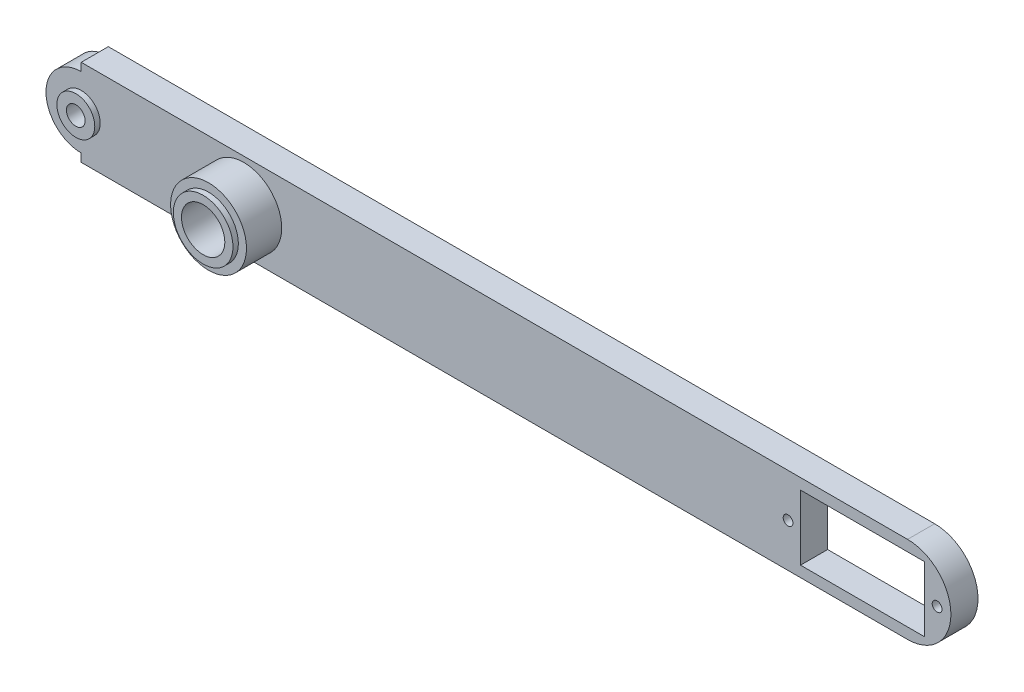
ISO-10303-21;
HEADER;
FILE_DESCRIPTION(('STEP AP214'),'2;1');
FILE_NAME('part.step','',(''),(''),'','','');
FILE_SCHEMA(('AUTOMOTIVE_DESIGN { 1 0 10303 214 1 1 1 1 }'));
ENDSEC;
DATA;
#1=APPLICATION_CONTEXT('core data for automotive mechanical design processes');
#2=APPLICATION_PROTOCOL_DEFINITION('international standard','automotive_design',2000,#1);
#3=PRODUCT_CONTEXT('',#1,'mechanical');
#4=PRODUCT('Part','Part','',(#3));
#5=PRODUCT_RELATED_PRODUCT_CATEGORY('part','',(#4));
#6=PRODUCT_DEFINITION_FORMATION('','',#4);
#7=PRODUCT_DEFINITION_CONTEXT('part definition',#1,'design');
#8=PRODUCT_DEFINITION('design','',#6,#7);
#9=PRODUCT_DEFINITION_SHAPE('','',#8);
#10=(LENGTH_UNIT() NAMED_UNIT(*) SI_UNIT(.MILLI.,.METRE.));
#11=(NAMED_UNIT(*) PLANE_ANGLE_UNIT() SI_UNIT($,.RADIAN.));
#12=(NAMED_UNIT(*) SI_UNIT($,.STERADIAN.) SOLID_ANGLE_UNIT());
#13=UNCERTAINTY_MEASURE_WITH_UNIT(LENGTH_MEASURE(1.E-05),#10,'distance_accuracy_value','');
#14=(GEOMETRIC_REPRESENTATION_CONTEXT(3) GLOBAL_UNCERTAINTY_ASSIGNED_CONTEXT((#13)) GLOBAL_UNIT_ASSIGNED_CONTEXT((#10,
#11,#12)) REPRESENTATION_CONTEXT('',''));
#15=CARTESIAN_POINT('',(0.,0.,0.));
#16=DIRECTION('',(0.,0.,1.));
#17=DIRECTION('',(1.,0.,0.));
#18=AXIS2_PLACEMENT_3D('',#15,#16,#17);
#19=CARTESIAN_POINT('',(-30.,8.,-4.));
#20=DIRECTION('',(1.,0.,0.));
#21=DIRECTION('',(0.,0.,-1.));
#22=AXIS2_PLACEMENT_3D('',#19,#20,#21);
#23=PLANE('',#22);
#24=DIRECTION('',(0.,0.,-1.));
#25=VECTOR('',#24,1.);
#26=CARTESIAN_POINT('',(-30.,-6.5,-4.));
#27=LINE('',#26,#25);
#28=CARTESIAN_POINT('',(-30.,-6.5,-9.));
#29=VERTEX_POINT('',#28);
#30=CARTESIAN_POINT('',(-30.,-6.5,-4.));
#31=VERTEX_POINT('',#30);
#32=EDGE_CURVE('E198',#29,#31,#27,.F.);
#33=ORIENTED_EDGE('',*,*,#32,.F.);
#34=DIRECTION('',(0.,-1.,0.));
#35=VECTOR('',#34,1.);
#36=CARTESIAN_POINT('',(-30.,8.,-9.));
#37=LINE('',#36,#35);
#38=CARTESIAN_POINT('',(-30.,-8.,-9.));
#39=VERTEX_POINT('',#38);
#40=EDGE_CURVE('E197',#29,#39,#37,.T.);
#41=ORIENTED_EDGE('',*,*,#40,.T.);
#42=DIRECTION('',(0.,0.,-1.));
#43=VECTOR('',#42,1.);
#44=CARTESIAN_POINT('',(-30.,-8.,-4.));
#45=LINE('',#44,#43);
#46=CARTESIAN_POINT('',(-30.,-8.,-4.));
#47=VERTEX_POINT('',#46);
#48=EDGE_CURVE('E50',#47,#39,#45,.T.);
#49=ORIENTED_EDGE('',*,*,#48,.F.);
#50=DIRECTION('',(0.,-1.,0.));
#51=VECTOR('',#50,1.);
#52=CARTESIAN_POINT('',(-30.,8.,-4.));
#53=LINE('',#52,#51);
#54=EDGE_CURVE('E203',#31,#47,#53,.T.);
#55=ORIENTED_EDGE('',*,*,#54,.F.);
#56=EDGE_LOOP('',(#33,#41,#49,#55));
#57=FACE_BOUND('',#56,.T.);
#58=ADVANCED_FACE('F39',(#57),#23,.F.);
#59=DIRECTION('',(0.,0.,-1.));
#60=VECTOR('',#59,1.);
#61=CARTESIAN_POINT('',(-30.,6.5,-4.));
#62=LINE('',#61,#60);
#63=CARTESIAN_POINT('',(-30.,6.5,-4.));
#64=VERTEX_POINT('',#63);
#65=CARTESIAN_POINT('',(-30.,6.5,-9.));
#66=VERTEX_POINT('',#65);
#67=EDGE_CURVE('E192',#64,#66,#62,.T.);
#68=ORIENTED_EDGE('',*,*,#67,.F.);
#69=CARTESIAN_POINT('',(-30.,8.,-4.));
#70=VERTEX_POINT('',#69);
#71=EDGE_CURVE('E199',#70,#64,#53,.T.);
#72=ORIENTED_EDGE('',*,*,#71,.F.);
#73=DIRECTION('',(0.,0.,-1.));
#74=VECTOR('',#73,1.);
#75=CARTESIAN_POINT('',(-30.,8.,-4.));
#76=LINE('',#75,#74);
#77=CARTESIAN_POINT('',(-30.,8.,-9.));
#78=VERTEX_POINT('',#77);
#79=EDGE_CURVE('E209',#70,#78,#76,.T.);
#80=ORIENTED_EDGE('',*,*,#79,.T.);
#81=EDGE_CURVE('E208',#78,#66,#37,.T.);
#82=ORIENTED_EDGE('',*,*,#81,.T.);
#83=EDGE_LOOP('',(#68,#72,#80,#82));
#84=FACE_BOUND('',#83,.T.);
#85=ADVANCED_FACE('F249',(#84),#23,.F.);
#86=CARTESIAN_POINT('',(-30.,-8.,-4.));
#87=DIRECTION('',(0.,1.,0.));
#88=DIRECTION('',(0.,0.,1.));
#89=AXIS2_PLACEMENT_3D('',#86,#87,#88);
#90=PLANE('',#89);
#91=DIRECTION('',(1.,0.,0.));
#92=VECTOR('',#91,1.);
#93=CARTESIAN_POINT('',(-30.,-8.,-9.));
#94=LINE('',#93,#92);
#95=CARTESIAN_POINT('',(122.5,-8.00000000000001,-9.));
#96=VERTEX_POINT('',#95);
#97=EDGE_CURVE('E214',#39,#96,#94,.T.);
#98=ORIENTED_EDGE('',*,*,#97,.T.);
#99=DIRECTION('',(0.,0.,-1.));
#100=VECTOR('',#99,1.);
#101=CARTESIAN_POINT('',(122.5,-8.,-4.));
#102=LINE('',#101,#100);
#103=CARTESIAN_POINT('',(122.5,-8.00000000000001,-4.));
#104=VERTEX_POINT('',#103);
#105=EDGE_CURVE('E222',#104,#96,#102,.T.);
#106=ORIENTED_EDGE('',*,*,#105,.F.);
#107=DIRECTION('',(1.,0.,0.));
#108=VECTOR('',#107,1.);
#109=CARTESIAN_POINT('',(-30.,-8.,-4.));
#110=LINE('',#109,#108);
#111=EDGE_CURVE('E204',#47,#104,#110,.T.);
#112=ORIENTED_EDGE('',*,*,#111,.F.);
#113=ORIENTED_EDGE('',*,*,#48,.T.);
#114=EDGE_LOOP('',(#98,#106,#112,#113));
#115=FACE_BOUND('',#114,.T.);
#116=ADVANCED_FACE('F227',(#115),#90,.F.);
#117=CARTESIAN_POINT('',(122.5,8.,-4.));
#118=DIRECTION('',(0.,-1.,0.));
#119=DIRECTION('',(0.,0.,-1.));
#120=AXIS2_PLACEMENT_3D('',#117,#118,#119);
#121=PLANE('',#120);
#122=DIRECTION('',(-1.,0.,0.));
#123=VECTOR('',#122,1.);
#124=CARTESIAN_POINT('',(122.5,8.,-9.));
#125=LINE('',#124,#123);
#126=CARTESIAN_POINT('',(122.5,8.,-9.));
#127=VERTEX_POINT('',#126);
#128=EDGE_CURVE('E213',#127,#78,#125,.T.);
#129=ORIENTED_EDGE('',*,*,#128,.T.);
#130=ORIENTED_EDGE('',*,*,#79,.F.);
#131=DIRECTION('',(-1.,0.,0.));
#132=VECTOR('',#131,1.);
#133=CARTESIAN_POINT('',(122.5,8.,-4.));
#134=LINE('',#133,#132);
#135=CARTESIAN_POINT('',(122.5,8.00000000000001,-4.));
#136=VERTEX_POINT('',#135);
#137=EDGE_CURVE('E210',#136,#70,#134,.T.);
#138=ORIENTED_EDGE('',*,*,#137,.F.);
#139=DIRECTION('',(0.,0.,-1.));
#140=VECTOR('',#139,1.);
#141=CARTESIAN_POINT('',(122.5,8.,-4.));
#142=LINE('',#141,#140);
#143=EDGE_CURVE('E217',#136,#127,#142,.T.);
#144=ORIENTED_EDGE('',*,*,#143,.T.);
#145=EDGE_LOOP('',(#129,#130,#138,#144));
#146=FACE_BOUND('',#145,.T.);
#147=ADVANCED_FACE('F241',(#146),#121,.F.);
#148=CARTESIAN_POINT('',(0.,0.,-4.));
#149=DIRECTION('',(0.,0.,1.));
#150=DIRECTION('',(1.,0.,0.));
#151=AXIS2_PLACEMENT_3D('',#148,#149,#150);
#152=PLANE('',#151);
#153=CARTESIAN_POINT('',(100.45,0.,-4.));
#154=DIRECTION('',(0.,0.,1.));
#155=DIRECTION('',(1.,0.,0.));
#156=AXIS2_PLACEMENT_3D('',#153,#154,#155);
#157=CIRCLE('',#156,0.899999999999998);
#158=CARTESIAN_POINT('',(101.35,0.,-4.));
#159=VERTEX_POINT('',#158);
#160=EDGE_CURVE('E136',#159,#159,#157,.T.);
#161=ORIENTED_EDGE('',*,*,#160,.F.);
#162=EDGE_LOOP('',(#161));
#163=FACE_BOUND('',#162,.T.);
#164=CARTESIAN_POINT('',(127.95,0.,-4.));
#165=DIRECTION('',(0.,0.,1.));
#166=DIRECTION('',(1.,0.,0.));
#167=AXIS2_PLACEMENT_3D('',#164,#165,#166);
#168=CIRCLE('',#167,0.900000000000012);
#169=CARTESIAN_POINT('',(128.85,0.,-4.));
#170=VERTEX_POINT('',#169);
#171=EDGE_CURVE('E138',#170,#170,#168,.T.);
#172=ORIENTED_EDGE('',*,*,#171,.F.);
#173=EDGE_LOOP('',(#172));
#174=FACE_BOUND('',#173,.T.);
#175=DIRECTION('',(0.,-1.,0.));
#176=VECTOR('',#175,1.);
#177=CARTESIAN_POINT('',(102.75,0.,-4.));
#178=LINE('',#177,#176);
#179=CARTESIAN_POINT('',(102.75,6.,-4.));
#180=VERTEX_POINT('',#179);
#181=CARTESIAN_POINT('',(102.75,-6.,-4.));
#182=VERTEX_POINT('',#181);
#183=EDGE_CURVE('E124',#180,#182,#178,.T.);
#184=ORIENTED_EDGE('',*,*,#183,.F.);
#185=DIRECTION('',(-1.,0.,0.));
#186=VECTOR('',#185,1.);
#187=CARTESIAN_POINT('',(0.,6.,-4.));
#188=LINE('',#187,#186);
#189=CARTESIAN_POINT('',(125.65,6.,-4.));
#190=VERTEX_POINT('',#189);
#191=EDGE_CURVE('E154',#190,#180,#188,.T.);
#192=ORIENTED_EDGE('',*,*,#191,.F.);
#193=DIRECTION('',(0.,1.,0.));
#194=VECTOR('',#193,1.);
#195=CARTESIAN_POINT('',(125.65,0.,-4.));
#196=LINE('',#195,#194);
#197=CARTESIAN_POINT('',(125.65,-6.,-4.));
#198=VERTEX_POINT('',#197);
#199=EDGE_CURVE('E151',#198,#190,#196,.T.);
#200=ORIENTED_EDGE('',*,*,#199,.F.);
#201=DIRECTION('',(1.,0.,0.));
#202=VECTOR('',#201,1.);
#203=CARTESIAN_POINT('',(0.,-6.,-4.));
#204=LINE('',#203,#202);
#205=EDGE_CURVE('E149',#182,#198,#204,.T.);
#206=ORIENTED_EDGE('',*,*,#205,.F.);
#207=EDGE_LOOP('',(#184,#192,#200,#206));
#208=FACE_BOUND('',#207,.T.);
#209=CARTESIAN_POINT('',(-30.,0.,-4.));
#210=DIRECTION('',(0.,0.,1.));
#211=DIRECTION('',(1.,0.,0.));
#212=AXIS2_PLACEMENT_3D('',#209,#210,#211);
#213=CIRCLE('',#212,3.5);
#214=CARTESIAN_POINT('',(-26.5,0.,-4.));
#215=VERTEX_POINT('',#214);
#216=EDGE_CURVE('E170',#215,#215,#213,.T.);
#217=ORIENTED_EDGE('',*,*,#216,.F.);
#218=EDGE_LOOP('',(#217));
#219=FACE_BOUND('',#218,.T.);
#220=CARTESIAN_POINT('',(0.,0.,-4.));
#221=DIRECTION('',(0.,0.,1.));
#222=DIRECTION('',(1.,0.,0.));
#223=AXIS2_PLACEMENT_3D('',#220,#221,#222);
#224=CIRCLE('',#223,7.);
#225=CARTESIAN_POINT('',(7.,0.,-4.));
#226=VERTEX_POINT('',#225);
#227=EDGE_CURVE('E177',#226,#226,#224,.F.);
#228=ORIENTED_EDGE('',*,*,#227,.T.);
#229=EDGE_LOOP('',(#228));
#230=FACE_BOUND('',#229,.T.);
#231=ORIENTED_EDGE('',*,*,#111,.T.);
#232=CARTESIAN_POINT('',(122.5,0.,-4.));
#233=DIRECTION('',(0.,0.,1.));
#234=DIRECTION('',(1.,0.,0.));
#235=AXIS2_PLACEMENT_3D('',#232,#233,#234);
#236=CIRCLE('',#235,8.00000000000001);
#237=EDGE_CURVE('E182',#104,#136,#236,.T.);
#238=ORIENTED_EDGE('',*,*,#237,.T.);
#239=ORIENTED_EDGE('',*,*,#137,.T.);
#240=ORIENTED_EDGE('',*,*,#71,.T.);
#241=CARTESIAN_POINT('',(-30.,0.,-4.));
#242=DIRECTION('',(0.,0.,1.));
#243=DIRECTION('',(1.,0.,0.));
#244=AXIS2_PLACEMENT_3D('',#241,#242,#243);
#245=CIRCLE('',#244,6.5);
#246=EDGE_CURVE('E189',#64,#31,#245,.T.);
#247=ORIENTED_EDGE('',*,*,#246,.T.);
#248=ORIENTED_EDGE('',*,*,#54,.T.);
#249=EDGE_LOOP('',(#231,#238,#239,#240,#247,#248));
#250=FACE_BOUND('',#249,.T.);
#251=ADVANCED_FACE('F244',(#163,#174,#208,#219,#230,#250),#152,.T.);
#252=CARTESIAN_POINT('',(0.,0.,-9.));
#253=DIRECTION('',(0.,0.,1.));
#254=DIRECTION('',(1.,0.,0.));
#255=AXIS2_PLACEMENT_3D('',#252,#253,#254);
#256=PLANE('',#255);
#257=CARTESIAN_POINT('',(40.,0.,-9.));
#258=DIRECTION('',(0.,0.,1.));
#259=DIRECTION('',(1.,0.,0.));
#260=AXIS2_PLACEMENT_3D('',#257,#258,#259);
#261=CIRCLE('',#260,2.);
#262=CARTESIAN_POINT('',(42.,0.,-9.));
#263=VERTEX_POINT('',#262);
#264=EDGE_CURVE('E530',#263,#263,#261,.T.);
#265=ORIENTED_EDGE('',*,*,#264,.T.);
#266=EDGE_LOOP('',(#265));
#267=FACE_BOUND('',#266,.T.);
#268=CARTESIAN_POINT('',(75.,0.,-9.));
#269=DIRECTION('',(0.,0.,1.));
#270=DIRECTION('',(1.,0.,0.));
#271=AXIS2_PLACEMENT_3D('',#268,#269,#270);
#272=CIRCLE('',#271,2.);
#273=CARTESIAN_POINT('',(77.,0.,-9.));
#274=VERTEX_POINT('',#273);
#275=EDGE_CURVE('E527',#274,#274,#272,.T.);
#276=ORIENTED_EDGE('',*,*,#275,.T.);
#277=EDGE_LOOP('',(#276));
#278=FACE_BOUND('',#277,.T.);
#279=CARTESIAN_POINT('',(100.45,0.,-9.));
#280=DIRECTION('',(0.,0.,1.));
#281=DIRECTION('',(1.,0.,0.));
#282=AXIS2_PLACEMENT_3D('',#279,#280,#281);
#283=CIRCLE('',#282,0.899999999999998);
#284=CARTESIAN_POINT('',(101.35,0.,-9.));
#285=VERTEX_POINT('',#284);
#286=EDGE_CURVE('E517',#285,#285,#283,.T.);
#287=ORIENTED_EDGE('',*,*,#286,.T.);
#288=EDGE_LOOP('',(#287));
#289=FACE_BOUND('',#288,.T.);
#290=CARTESIAN_POINT('',(127.95,0.,-9.));
#291=DIRECTION('',(0.,0.,1.));
#292=DIRECTION('',(1.,0.,0.));
#293=AXIS2_PLACEMENT_3D('',#290,#291,#292);
#294=CIRCLE('',#293,0.900000000000012);
#295=CARTESIAN_POINT('',(128.85,0.,-9.));
#296=VERTEX_POINT('',#295);
#297=EDGE_CURVE('E520',#296,#296,#294,.T.);
#298=ORIENTED_EDGE('',*,*,#297,.T.);
#299=EDGE_LOOP('',(#298));
#300=FACE_BOUND('',#299,.T.);
#301=DIRECTION('',(-1.,0.,0.));
#302=VECTOR('',#301,1.);
#303=CARTESIAN_POINT('',(125.65,6.,-9.));
#304=LINE('',#303,#302);
#305=CARTESIAN_POINT('',(125.65,6.,-9.));
#306=VERTEX_POINT('',#305);
#307=CARTESIAN_POINT('',(102.75,6.,-9.));
#308=VERTEX_POINT('',#307);
#309=EDGE_CURVE('E127',#306,#308,#304,.T.);
#310=ORIENTED_EDGE('',*,*,#309,.T.);
#311=DIRECTION('',(0.,-1.,0.));
#312=VECTOR('',#311,1.);
#313=CARTESIAN_POINT('',(102.75,6.,-9.));
#314=LINE('',#313,#312);
#315=CARTESIAN_POINT('',(102.75,-6.,-9.));
#316=VERTEX_POINT('',#315);
#317=EDGE_CURVE('E119',#308,#316,#314,.T.);
#318=ORIENTED_EDGE('',*,*,#317,.T.);
#319=DIRECTION('',(1.,0.,0.));
#320=VECTOR('',#319,1.);
#321=CARTESIAN_POINT('',(102.75,-6.,-9.));
#322=LINE('',#321,#320);
#323=CARTESIAN_POINT('',(125.65,-6.,-9.));
#324=VERTEX_POINT('',#323);
#325=EDGE_CURVE('E126',#316,#324,#322,.T.);
#326=ORIENTED_EDGE('',*,*,#325,.T.);
#327=DIRECTION('',(0.,1.,0.));
#328=VECTOR('',#327,1.);
#329=CARTESIAN_POINT('',(125.65,-6.,-9.));
#330=LINE('',#329,#328);
#331=EDGE_CURVE('E65',#324,#306,#330,.T.);
#332=ORIENTED_EDGE('',*,*,#331,.T.);
#333=EDGE_LOOP('',(#310,#318,#326,#332));
#334=FACE_BOUND('',#333,.T.);
#335=CARTESIAN_POINT('',(-30.,0.,-9.));
#336=DIRECTION('',(0.,0.,1.));
#337=DIRECTION('',(1.,0.,0.));
#338=AXIS2_PLACEMENT_3D('',#335,#336,#337);
#339=CIRCLE('',#338,1.725);
#340=CARTESIAN_POINT('',(-28.275,0.,-9.));
#341=VERTEX_POINT('',#340);
#342=EDGE_CURVE('E159',#341,#341,#339,.T.);
#343=ORIENTED_EDGE('',*,*,#342,.T.);
#344=EDGE_LOOP('',(#343));
#345=FACE_BOUND('',#344,.T.);
#346=CARTESIAN_POINT('',(0.,0.,-9.));
#347=DIRECTION('',(0.,0.,1.));
#348=DIRECTION('',(1.,0.,0.));
#349=AXIS2_PLACEMENT_3D('',#346,#347,#348);
#350=CIRCLE('',#349,4.);
#351=CARTESIAN_POINT('',(4.,0.,-9.));
#352=VERTEX_POINT('',#351);
#353=EDGE_CURVE('E165',#352,#352,#350,.T.);
#354=ORIENTED_EDGE('',*,*,#353,.T.);
#355=EDGE_LOOP('',(#354));
#356=FACE_BOUND('',#355,.T.);
#357=ORIENTED_EDGE('',*,*,#128,.F.);
#358=CARTESIAN_POINT('',(122.5,0.,-9.));
#359=DIRECTION('',(0.,0.,1.));
#360=DIRECTION('',(1.,0.,0.));
#361=AXIS2_PLACEMENT_3D('',#358,#359,#360);
#362=CIRCLE('',#361,8.00000000000001);
#363=EDGE_CURVE('E185',#96,#127,#362,.T.);
#364=ORIENTED_EDGE('',*,*,#363,.F.);
#365=ORIENTED_EDGE('',*,*,#97,.F.);
#366=ORIENTED_EDGE('',*,*,#40,.F.);
#367=CARTESIAN_POINT('',(-30.,0.,-9.));
#368=DIRECTION('',(0.,0.,1.));
#369=DIRECTION('',(1.,0.,0.));
#370=AXIS2_PLACEMENT_3D('',#367,#368,#369);
#371=CIRCLE('',#370,6.5);
#372=EDGE_CURVE('E187',#66,#29,#371,.T.);
#373=ORIENTED_EDGE('',*,*,#372,.F.);
#374=ORIENTED_EDGE('',*,*,#81,.F.);
#375=EDGE_LOOP('',(#357,#364,#365,#366,#373,#374));
#376=FACE_BOUND('',#375,.T.);
#377=ADVANCED_FACE('F131',(#267,#278,#289,#300,#334,#345,#356,#376),#256,.F.);
#378=CARTESIAN_POINT('',(-30.,0.,-4.));
#379=DIRECTION('',(0.,0.,-1.));
#380=DIRECTION('',(-1.,0.,0.));
#381=AXIS2_PLACEMENT_3D('',#378,#379,#380);
#382=CYLINDRICAL_SURFACE('',#381,6.5);
#383=ORIENTED_EDGE('',*,*,#372,.T.);
#384=ORIENTED_EDGE('',*,*,#32,.T.);
#385=ORIENTED_EDGE('',*,*,#246,.F.);
#386=ORIENTED_EDGE('',*,*,#67,.T.);
#387=EDGE_LOOP('',(#383,#384,#385,#386));
#388=FACE_BOUND('',#387,.T.);
#389=ADVANCED_FACE('F247',(#388),#382,.T.);
#390=CARTESIAN_POINT('',(122.5,0.,-4.));
#391=DIRECTION('',(0.,0.,-1.));
#392=DIRECTION('',(-1.,0.,0.));
#393=AXIS2_PLACEMENT_3D('',#390,#391,#392);
#394=CYLINDRICAL_SURFACE('',#393,8.00000000000001);
#395=ORIENTED_EDGE('',*,*,#237,.F.);
#396=ORIENTED_EDGE('',*,*,#105,.T.);
#397=ORIENTED_EDGE('',*,*,#363,.T.);
#398=ORIENTED_EDGE('',*,*,#143,.F.);
#399=EDGE_LOOP('',(#395,#396,#397,#398));
#400=FACE_BOUND('',#399,.T.);
#401=ADVANCED_FACE('F238',(#400),#394,.T.);
#402=CARTESIAN_POINT('',(0.,0.,2.5));
#403=DIRECTION('',(0.,0.,-1.));
#404=DIRECTION('',(-1.,0.,0.));
#405=AXIS2_PLACEMENT_3D('',#402,#403,#404);
#406=CYLINDRICAL_SURFACE('',#405,7.);
#407=ORIENTED_EDGE('',*,*,#227,.F.);
#408=EDGE_LOOP('',(#407));
#409=FACE_BOUND('',#408,.T.);
#410=CARTESIAN_POINT('',(0.,0.,2.5));
#411=DIRECTION('',(0.,0.,1.));
#412=DIRECTION('',(1.,0.,0.));
#413=AXIS2_PLACEMENT_3D('',#410,#411,#412);
#414=CIRCLE('',#413,7.);
#415=CARTESIAN_POINT('',(7.,0.,2.5));
#416=VERTEX_POINT('',#415);
#417=EDGE_CURVE('E174',#416,#416,#414,.T.);
#418=ORIENTED_EDGE('',*,*,#417,.F.);
#419=EDGE_LOOP('',(#418));
#420=FACE_BOUND('',#419,.T.);
#421=ADVANCED_FACE('F278',(#409,#420),#406,.T.);
#422=CARTESIAN_POINT('',(0.,0.,2.5));
#423=DIRECTION('',(0.,0.,1.));
#424=DIRECTION('',(1.,0.,0.));
#425=AXIS2_PLACEMENT_3D('',#422,#423,#424);
#426=PLANE('',#425);
#427=CARTESIAN_POINT('',(0.,0.,2.5));
#428=DIRECTION('',(0.,0.,1.));
#429=DIRECTION('',(1.,0.,0.));
#430=AXIS2_PLACEMENT_3D('',#427,#428,#429);
#431=CIRCLE('',#430,5.5);
#432=CARTESIAN_POINT('',(5.5,0.,2.5));
#433=VERTEX_POINT('',#432);
#434=EDGE_CURVE('E11',#433,#433,#431,.T.);
#435=ORIENTED_EDGE('',*,*,#434,.F.);
#436=EDGE_LOOP('',(#435));
#437=FACE_BOUND('',#436,.T.);
#438=ORIENTED_EDGE('',*,*,#417,.T.);
#439=EDGE_LOOP('',(#438));
#440=FACE_BOUND('',#439,.T.);
#441=ADVANCED_FACE('F288',(#437,#440),#426,.T.);
#442=CARTESIAN_POINT('',(0.,0.,3.5));
#443=DIRECTION('',(0.,0.,-1.));
#444=DIRECTION('',(-1.,0.,0.));
#445=AXIS2_PLACEMENT_3D('',#442,#443,#444);
#446=CYLINDRICAL_SURFACE('',#445,5.5);
#447=CARTESIAN_POINT('',(0.,0.,3.5));
#448=DIRECTION('',(0.,0.,1.));
#449=DIRECTION('',(1.,0.,0.));
#450=AXIS2_PLACEMENT_3D('',#447,#448,#449);
#451=CIRCLE('',#450,5.5);
#452=CARTESIAN_POINT('',(5.5,0.,3.5));
#453=VERTEX_POINT('',#452);
#454=EDGE_CURVE('E171',#453,#453,#451,.T.);
#455=ORIENTED_EDGE('',*,*,#454,.F.);
#456=EDGE_LOOP('',(#455));
#457=FACE_BOUND('',#456,.T.);
#458=ORIENTED_EDGE('',*,*,#434,.T.);
#459=EDGE_LOOP('',(#458));
#460=FACE_BOUND('',#459,.T.);
#461=ADVANCED_FACE('F296',(#457,#460),#446,.T.);
#462=CARTESIAN_POINT('',(0.,0.,3.5));
#463=DIRECTION('',(0.,0.,1.));
#464=DIRECTION('',(1.,0.,0.));
#465=AXIS2_PLACEMENT_3D('',#462,#463,#464);
#466=PLANE('',#465);
#467=CARTESIAN_POINT('',(0.,0.,3.5));
#468=DIRECTION('',(0.,0.,1.));
#469=DIRECTION('',(1.,0.,0.));
#470=AXIS2_PLACEMENT_3D('',#467,#468,#469);
#471=CIRCLE('',#470,4.);
#472=CARTESIAN_POINT('',(4.,0.,3.5));
#473=VERTEX_POINT('',#472);
#474=EDGE_CURVE('E163',#473,#473,#471,.T.);
#475=ORIENTED_EDGE('',*,*,#474,.F.);
#476=EDGE_LOOP('',(#475));
#477=FACE_BOUND('',#476,.T.);
#478=ORIENTED_EDGE('',*,*,#454,.T.);
#479=EDGE_LOOP('',(#478));
#480=FACE_BOUND('',#479,.T.);
#481=ADVANCED_FACE('F310',(#477,#480),#466,.T.);
#482=CARTESIAN_POINT('',(-30.,0.,-3.));
#483=DIRECTION('',(0.,0.,-1.));
#484=DIRECTION('',(-1.,0.,0.));
#485=AXIS2_PLACEMENT_3D('',#482,#483,#484);
#486=CYLINDRICAL_SURFACE('',#485,3.5);
#487=CARTESIAN_POINT('',(-30.,0.,-3.));
#488=DIRECTION('',(0.,0.,1.));
#489=DIRECTION('',(1.,0.,0.));
#490=AXIS2_PLACEMENT_3D('',#487,#488,#489);
#491=CIRCLE('',#490,3.5);
#492=CARTESIAN_POINT('',(-26.5,0.,-3.));
#493=VERTEX_POINT('',#492);
#494=EDGE_CURVE('E166',#493,#493,#491,.T.);
#495=ORIENTED_EDGE('',*,*,#494,.F.);
#496=EDGE_LOOP('',(#495));
#497=FACE_BOUND('',#496,.T.);
#498=ORIENTED_EDGE('',*,*,#216,.T.);
#499=EDGE_LOOP('',(#498));
#500=FACE_BOUND('',#499,.T.);
#501=ADVANCED_FACE('F317',(#497,#500),#486,.T.);
#502=CARTESIAN_POINT('',(-30.,0.,-3.));
#503=DIRECTION('',(0.,0.,1.));
#504=DIRECTION('',(1.,0.,0.));
#505=AXIS2_PLACEMENT_3D('',#502,#503,#504);
#506=PLANE('',#505);
#507=CARTESIAN_POINT('',(-30.,0.,-3.));
#508=DIRECTION('',(0.,0.,1.));
#509=DIRECTION('',(1.,0.,0.));
#510=AXIS2_PLACEMENT_3D('',#507,#508,#509);
#511=CIRCLE('',#510,1.725);
#512=CARTESIAN_POINT('',(-28.275,0.,-3.));
#513=VERTEX_POINT('',#512);
#514=EDGE_CURVE('E45',#513,#513,#511,.T.);
#515=ORIENTED_EDGE('',*,*,#514,.F.);
#516=EDGE_LOOP('',(#515));
#517=FACE_BOUND('',#516,.T.);
#518=ORIENTED_EDGE('',*,*,#494,.T.);
#519=EDGE_LOOP('',(#518));
#520=FACE_BOUND('',#519,.T.);
#521=ADVANCED_FACE('F323',(#517,#520),#506,.T.);
#522=CARTESIAN_POINT('',(0.,0.,-9.));
#523=DIRECTION('',(0.,0.,1.));
#524=DIRECTION('',(1.,0.,0.));
#525=AXIS2_PLACEMENT_3D('',#522,#523,#524);
#526=CYLINDRICAL_SURFACE('',#525,4.);
#527=ORIENTED_EDGE('',*,*,#353,.F.);
#528=EDGE_LOOP('',(#527));
#529=FACE_BOUND('',#528,.T.);
#530=ORIENTED_EDGE('',*,*,#474,.T.);
#531=EDGE_LOOP('',(#530));
#532=FACE_BOUND('',#531,.T.);
#533=ADVANCED_FACE('F333',(#529,#532),#526,.F.);
#534=CARTESIAN_POINT('',(-30.,0.,-9.));
#535=DIRECTION('',(0.,0.,1.));
#536=DIRECTION('',(1.,0.,0.));
#537=AXIS2_PLACEMENT_3D('',#534,#535,#536);
#538=CYLINDRICAL_SURFACE('',#537,1.725);
#539=ORIENTED_EDGE('',*,*,#514,.T.);
#540=EDGE_LOOP('',(#539));
#541=FACE_BOUND('',#540,.T.);
#542=ORIENTED_EDGE('',*,*,#342,.F.);
#543=EDGE_LOOP('',(#542));
#544=FACE_BOUND('',#543,.T.);
#545=ADVANCED_FACE('F345',(#541,#544),#538,.F.);
#546=CARTESIAN_POINT('',(102.75,6.,-9.));
#547=DIRECTION('',(-1.,0.,0.));
#548=DIRECTION('',(0.,0.,1.));
#549=AXIS2_PLACEMENT_3D('',#546,#547,#548);
#550=PLANE('',#549);
#551=ORIENTED_EDGE('',*,*,#183,.T.);
#552=DIRECTION('',(0.,0.,1.));
#553=VECTOR('',#552,1.);
#554=CARTESIAN_POINT('',(102.75,-6.,-9.));
#555=LINE('',#554,#553);
#556=EDGE_CURVE('E54',#316,#182,#555,.T.);
#557=ORIENTED_EDGE('',*,*,#556,.F.);
#558=ORIENTED_EDGE('',*,*,#317,.F.);
#559=DIRECTION('',(0.,0.,1.));
#560=VECTOR('',#559,1.);
#561=CARTESIAN_POINT('',(102.75,6.,-9.));
#562=LINE('',#561,#560);
#563=EDGE_CURVE('E143',#308,#180,#562,.T.);
#564=ORIENTED_EDGE('',*,*,#563,.T.);
#565=EDGE_LOOP('',(#551,#557,#558,#564));
#566=FACE_BOUND('',#565,.T.);
#567=ADVANCED_FACE('F120',(#566),#550,.F.);
#568=CARTESIAN_POINT('',(125.65,6.,-9.));
#569=DIRECTION('',(0.,1.,0.));
#570=DIRECTION('',(0.,0.,1.));
#571=AXIS2_PLACEMENT_3D('',#568,#569,#570);
#572=PLANE('',#571);
#573=ORIENTED_EDGE('',*,*,#191,.T.);
#574=ORIENTED_EDGE('',*,*,#563,.F.);
#575=ORIENTED_EDGE('',*,*,#309,.F.);
#576=DIRECTION('',(0.,0.,1.));
#577=VECTOR('',#576,1.);
#578=CARTESIAN_POINT('',(125.65,6.,-9.));
#579=LINE('',#578,#577);
#580=EDGE_CURVE('E150',#306,#190,#579,.T.);
#581=ORIENTED_EDGE('',*,*,#580,.T.);
#582=EDGE_LOOP('',(#573,#574,#575,#581));
#583=FACE_BOUND('',#582,.T.);
#584=ADVANCED_FACE('F359',(#583),#572,.F.);
#585=CARTESIAN_POINT('',(125.65,-6.,-9.));
#586=DIRECTION('',(1.,0.,0.));
#587=DIRECTION('',(0.,0.,-1.));
#588=AXIS2_PLACEMENT_3D('',#585,#586,#587);
#589=PLANE('',#588);
#590=ORIENTED_EDGE('',*,*,#199,.T.);
#591=ORIENTED_EDGE('',*,*,#580,.F.);
#592=ORIENTED_EDGE('',*,*,#331,.F.);
#593=DIRECTION('',(0.,0.,1.));
#594=VECTOR('',#593,1.);
#595=CARTESIAN_POINT('',(125.65,-6.,-9.));
#596=LINE('',#595,#594);
#597=EDGE_CURVE('E123',#324,#198,#596,.T.);
#598=ORIENTED_EDGE('',*,*,#597,.T.);
#599=EDGE_LOOP('',(#590,#591,#592,#598));
#600=FACE_BOUND('',#599,.T.);
#601=ADVANCED_FACE('F368',(#600),#589,.F.);
#602=CARTESIAN_POINT('',(102.75,-6.,-9.));
#603=DIRECTION('',(0.,-1.,0.));
#604=DIRECTION('',(0.,0.,-1.));
#605=AXIS2_PLACEMENT_3D('',#602,#603,#604);
#606=PLANE('',#605);
#607=ORIENTED_EDGE('',*,*,#205,.T.);
#608=ORIENTED_EDGE('',*,*,#597,.F.);
#609=ORIENTED_EDGE('',*,*,#325,.F.);
#610=ORIENTED_EDGE('',*,*,#556,.T.);
#611=EDGE_LOOP('',(#607,#608,#609,#610));
#612=FACE_BOUND('',#611,.T.);
#613=ADVANCED_FACE('F128',(#612),#606,.F.);
#614=CARTESIAN_POINT('',(127.95,0.,-9.));
#615=DIRECTION('',(0.,0.,1.));
#616=DIRECTION('',(1.,0.,0.));
#617=AXIS2_PLACEMENT_3D('',#614,#615,#616);
#618=CYLINDRICAL_SURFACE('',#617,0.900000000000012);
#619=ORIENTED_EDGE('',*,*,#171,.T.);
#620=EDGE_LOOP('',(#619));
#621=FACE_BOUND('',#620,.T.);
#622=ORIENTED_EDGE('',*,*,#297,.F.);
#623=EDGE_LOOP('',(#622));
#624=FACE_BOUND('',#623,.T.);
#625=ADVANCED_FACE('F381',(#621,#624),#618,.F.);
#626=CARTESIAN_POINT('',(100.45,0.,-9.));
#627=DIRECTION('',(0.,0.,1.));
#628=DIRECTION('',(1.,0.,0.));
#629=AXIS2_PLACEMENT_3D('',#626,#627,#628);
#630=CYLINDRICAL_SURFACE('',#629,0.899999999999998);
#631=ORIENTED_EDGE('',*,*,#160,.T.);
#632=EDGE_LOOP('',(#631));
#633=FACE_BOUND('',#632,.T.);
#634=ORIENTED_EDGE('',*,*,#286,.F.);
#635=EDGE_LOOP('',(#634));
#636=FACE_BOUND('',#635,.T.);
#637=ADVANCED_FACE('F395',(#633,#636),#630,.F.);
#638=CARTESIAN_POINT('',(75.,0.,-5.));
#639=DIRECTION('',(0.,0.,-1.));
#640=DIRECTION('',(-1.,0.,0.));
#641=AXIS2_PLACEMENT_3D('',#638,#639,#640);
#642=CYLINDRICAL_SURFACE('',#641,2.);
#643=CARTESIAN_POINT('',(75.,0.,-5.));
#644=DIRECTION('',(0.,0.,1.));
#645=DIRECTION('',(1.,0.,0.));
#646=AXIS2_PLACEMENT_3D('',#643,#644,#645);
#647=CIRCLE('',#646,2.);
#648=CARTESIAN_POINT('',(77.,0.,-5.));
#649=VERTEX_POINT('',#648);
#650=EDGE_CURVE('E522',#649,#649,#647,.T.);
#651=ORIENTED_EDGE('',*,*,#650,.T.);
#652=EDGE_LOOP('',(#651));
#653=FACE_BOUND('',#652,.T.);
#654=ORIENTED_EDGE('',*,*,#275,.F.);
#655=EDGE_LOOP('',(#654));
#656=FACE_BOUND('',#655,.T.);
#657=ADVANCED_FACE('F402',(#653,#656),#642,.F.);
#658=CARTESIAN_POINT('',(75.,0.,-5.));
#659=DIRECTION('',(0.,0.,1.));
#660=DIRECTION('',(1.,0.,0.));
#661=AXIS2_PLACEMENT_3D('',#658,#659,#660);
#662=PLANE('',#661);
#663=ORIENTED_EDGE('',*,*,#650,.F.);
#664=EDGE_LOOP('',(#663));
#665=FACE_BOUND('',#664,.T.);
#666=ADVANCED_FACE('F408',(#665),#662,.F.);
#667=CARTESIAN_POINT('',(40.,0.,-5.));
#668=DIRECTION('',(0.,0.,-1.));
#669=DIRECTION('',(-1.,0.,0.));
#670=AXIS2_PLACEMENT_3D('',#667,#668,#669);
#671=CYLINDRICAL_SURFACE('',#670,2.);
#672=CARTESIAN_POINT('',(40.,0.,-5.));
#673=DIRECTION('',(0.,0.,1.));
#674=DIRECTION('',(1.,0.,0.));
#675=AXIS2_PLACEMENT_3D('',#672,#673,#674);
#676=CIRCLE('',#675,2.);
#677=CARTESIAN_POINT('',(42.,0.,-5.));
#678=VERTEX_POINT('',#677);
#679=EDGE_CURVE('E525',#678,#678,#676,.T.);
#680=ORIENTED_EDGE('',*,*,#679,.T.);
#681=EDGE_LOOP('',(#680));
#682=FACE_BOUND('',#681,.T.);
#683=ORIENTED_EDGE('',*,*,#264,.F.);
#684=EDGE_LOOP('',(#683));
#685=FACE_BOUND('',#684,.T.);
#686=ADVANCED_FACE('F418',(#682,#685),#671,.F.);
#687=CARTESIAN_POINT('',(40.,0.,-5.));
#688=DIRECTION('',(0.,0.,1.));
#689=DIRECTION('',(1.,0.,0.));
#690=AXIS2_PLACEMENT_3D('',#687,#688,#689);
#691=PLANE('',#690);
#692=ORIENTED_EDGE('',*,*,#679,.F.);
#693=EDGE_LOOP('',(#692));
#694=FACE_BOUND('',#693,.T.);
#695=ADVANCED_FACE('F426',(#694),#691,.F.);
#696=CLOSED_SHELL('',(#58,#85,#116,#147,#251,#377,#389,#401,#421,#441,#461,#481,#501,#521,#533,
#545,#567,#584,#601,#613,#625,#637,#657,#666,#686,#695));
#697=MANIFOLD_SOLID_BREP('B2',#696);
#698=ADVANCED_BREP_SHAPE_REPRESENTATION('',(#18,#697),#14);
#699=SHAPE_DEFINITION_REPRESENTATION(#9,#698);
ENDSEC;
END-ISO-10303-21;
